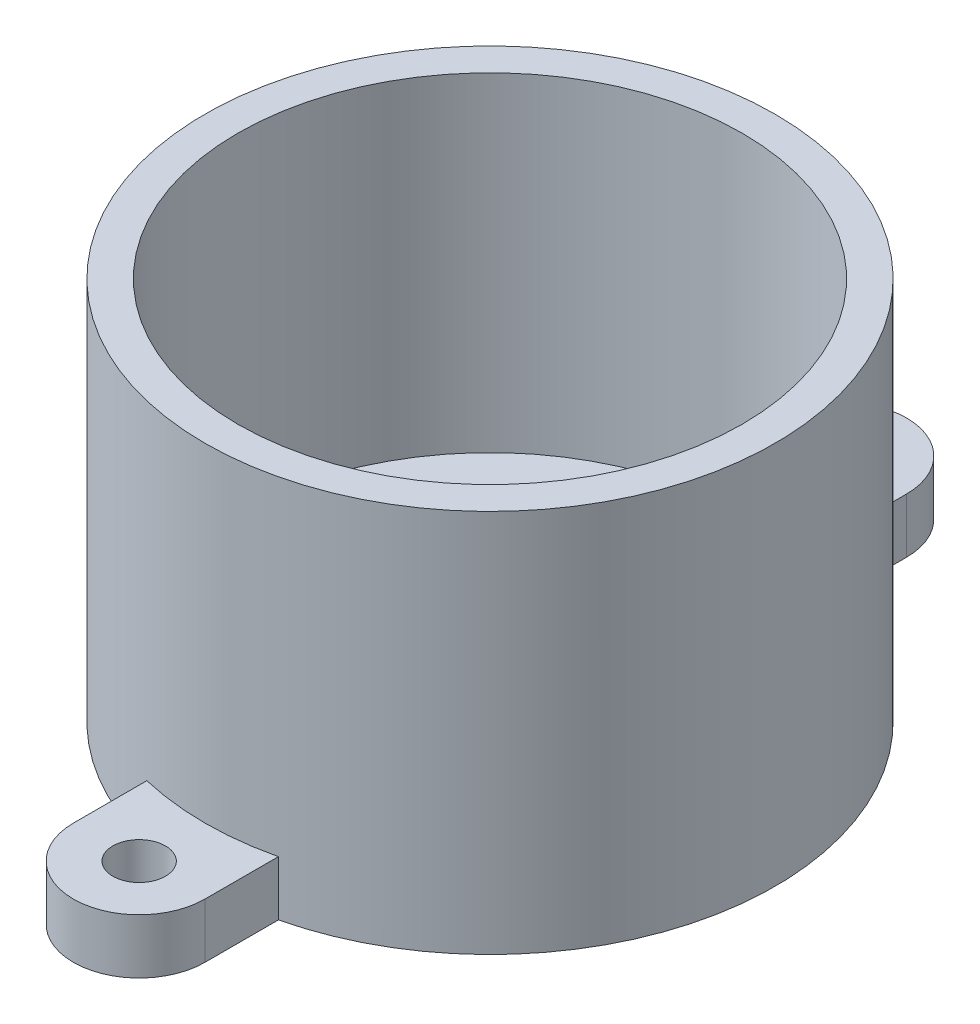
ISO-10303-21;
HEADER;
FILE_DESCRIPTION(('STEP AP214'),'2;1');
FILE_NAME('part.step','',(''),(''),'','','');
FILE_SCHEMA(('AUTOMOTIVE_DESIGN { 1 0 10303 214 1 1 1 1 }'));
ENDSEC;
DATA;
#1=APPLICATION_CONTEXT('core data for automotive mechanical design processes');
#2=APPLICATION_PROTOCOL_DEFINITION('international standard','automotive_design',2000,#1);
#3=PRODUCT_CONTEXT('',#1,'mechanical');
#4=PRODUCT('Part','Part','',(#3));
#5=PRODUCT_RELATED_PRODUCT_CATEGORY('part','',(#4));
#6=PRODUCT_DEFINITION_FORMATION('','',#4);
#7=PRODUCT_DEFINITION_CONTEXT('part definition',#1,'design');
#8=PRODUCT_DEFINITION('design','',#6,#7);
#9=PRODUCT_DEFINITION_SHAPE('','',#8);
#10=(LENGTH_UNIT() NAMED_UNIT(*) SI_UNIT(.MILLI.,.METRE.));
#11=(NAMED_UNIT(*) PLANE_ANGLE_UNIT() SI_UNIT($,.RADIAN.));
#12=(NAMED_UNIT(*) SI_UNIT($,.STERADIAN.) SOLID_ANGLE_UNIT());
#13=UNCERTAINTY_MEASURE_WITH_UNIT(LENGTH_MEASURE(1.E-05),#10,'distance_accuracy_value','');
#14=(GEOMETRIC_REPRESENTATION_CONTEXT(3) GLOBAL_UNCERTAINTY_ASSIGNED_CONTEXT((#13)) GLOBAL_UNIT_ASSIGNED_CONTEXT((#10,
#11,#12)) REPRESENTATION_CONTEXT('',''));
#15=CARTESIAN_POINT('',(0.,0.,0.));
#16=DIRECTION('',(0.,0.,1.));
#17=DIRECTION('',(1.,0.,0.));
#18=AXIS2_PLACEMENT_3D('',#15,#16,#17);
#19=CARTESIAN_POINT('',(0.,2.5,0.));
#20=DIRECTION('',(0.,-1.,0.));
#21=DIRECTION('',(0.,0.,-1.));
#22=AXIS2_PLACEMENT_3D('',#19,#20,#21);
#23=CYLINDRICAL_SURFACE('',#22,13.);
#24=CARTESIAN_POINT('',(0.,17.5,0.));
#25=DIRECTION('',(0.,1.,0.));
#26=DIRECTION('',(0.,0.,1.));
#27=AXIS2_PLACEMENT_3D('',#24,#25,#26);
#28=CIRCLE('',#27,13.);
#29=CARTESIAN_POINT('',(0.,17.5,13.));
#30=VERTEX_POINT('',#29);
#31=EDGE_CURVE('E238',#30,#30,#28,.T.);
#32=ORIENTED_EDGE('',*,*,#31,.F.);
#33=EDGE_LOOP('',(#32));
#34=FACE_BOUND('',#33,.T.);
#35=DIRECTION('',(0.,-1.,0.));
#36=VECTOR('',#35,1.);
#37=CARTESIAN_POINT('',(3.,2.5,-12.6491106406735));
#38=LINE('',#37,#36);
#39=CARTESIAN_POINT('',(3.,2.5,-12.6491106406735));
#40=VERTEX_POINT('',#39);
#41=CARTESIAN_POINT('',(3.,0.,-12.6491106406735));
#42=VERTEX_POINT('',#41);
#43=EDGE_CURVE('E62',#40,#42,#38,.T.);
#44=ORIENTED_EDGE('',*,*,#43,.F.);
#45=CARTESIAN_POINT('',(0.,2.5,0.));
#46=DIRECTION('',(0.,-1.,0.));
#47=DIRECTION('',(0.,0.,1.));
#48=AXIS2_PLACEMENT_3D('',#45,#46,#47);
#49=CIRCLE('',#48,13.);
#50=CARTESIAN_POINT('',(-3.,2.5,-12.6491106406735));
#51=VERTEX_POINT('',#50);
#52=EDGE_CURVE('E67',#51,#40,#49,.T.);
#53=ORIENTED_EDGE('',*,*,#52,.F.);
#54=DIRECTION('',(0.,-1.,0.));
#55=VECTOR('',#54,1.);
#56=CARTESIAN_POINT('',(-3.,2.5,-12.6491106406735));
#57=LINE('',#56,#55);
#58=CARTESIAN_POINT('',(-3.,0.,-12.6491106406735));
#59=VERTEX_POINT('',#58);
#60=EDGE_CURVE('E137',#51,#59,#57,.T.);
#61=ORIENTED_EDGE('',*,*,#60,.T.);
#62=CARTESIAN_POINT('',(0.,0.,0.));
#63=DIRECTION('',(0.,1.,0.));
#64=DIRECTION('',(0.,0.,1.));
#65=AXIS2_PLACEMENT_3D('',#62,#63,#64);
#66=CIRCLE('',#65,13.);
#67=CARTESIAN_POINT('',(-3.,0.,12.6491106406735));
#68=VERTEX_POINT('',#67);
#69=EDGE_CURVE('E242',#59,#68,#66,.T.);
#70=ORIENTED_EDGE('',*,*,#69,.T.);
#71=DIRECTION('',(0.,-1.,0.));
#72=VECTOR('',#71,1.);
#73=CARTESIAN_POINT('',(-3.,2.5,12.6491106406735));
#74=LINE('',#73,#72);
#75=CARTESIAN_POINT('',(-3.,2.5,12.6491106406735));
#76=VERTEX_POINT('',#75);
#77=EDGE_CURVE('E166',#76,#68,#74,.T.);
#78=ORIENTED_EDGE('',*,*,#77,.F.);
#79=CARTESIAN_POINT('',(0.,2.5,0.));
#80=DIRECTION('',(0.,-1.,0.));
#81=DIRECTION('',(0.,0.,-1.));
#82=AXIS2_PLACEMENT_3D('',#79,#80,#81);
#83=CIRCLE('',#82,13.);
#84=CARTESIAN_POINT('',(3.,2.5,12.6491106406735));
#85=VERTEX_POINT('',#84);
#86=EDGE_CURVE('E190',#85,#76,#83,.T.);
#87=ORIENTED_EDGE('',*,*,#86,.F.);
#88=DIRECTION('',(0.,-1.,0.));
#89=VECTOR('',#88,1.);
#90=CARTESIAN_POINT('',(3.,2.5,12.6491106406735));
#91=LINE('',#90,#89);
#92=CARTESIAN_POINT('',(3.,0.,12.6491106406735));
#93=VERTEX_POINT('',#92);
#94=EDGE_CURVE('E162',#85,#93,#91,.T.);
#95=ORIENTED_EDGE('',*,*,#94,.T.);
#96=EDGE_CURVE('E54',#93,#42,#66,.T.);
#97=ORIENTED_EDGE('',*,*,#96,.T.);
#98=EDGE_LOOP('',(#44,#53,#61,#70,#78,#87,#95,#97));
#99=FACE_BOUND('',#98,.T.);
#100=ADVANCED_FACE('F45',(#34,#99),#23,.T.);
#101=CARTESIAN_POINT('',(0.,0.,0.));
#102=DIRECTION('',(0.,1.,0.));
#103=DIRECTION('',(0.,0.,1.));
#104=AXIS2_PLACEMENT_3D('',#101,#102,#103);
#105=PLANE('',#104);
#106=CARTESIAN_POINT('',(0.,0.,-8.5));
#107=DIRECTION('',(0.,1.,0.));
#108=DIRECTION('',(0.,0.,1.));
#109=AXIS2_PLACEMENT_3D('',#106,#107,#108);
#110=CIRCLE('',#109,1.2);
#111=CARTESIAN_POINT('',(0.,0.,-7.3));
#112=VERTEX_POINT('',#111);
#113=EDGE_CURVE('E222',#112,#112,#110,.T.);
#114=ORIENTED_EDGE('',*,*,#113,.T.);
#115=EDGE_LOOP('',(#114));
#116=FACE_BOUND('',#115,.T.);
#117=CARTESIAN_POINT('',(0.,0.,0.));
#118=DIRECTION('',(0.,1.,0.));
#119=DIRECTION('',(0.,0.,1.));
#120=AXIS2_PLACEMENT_3D('',#117,#118,#119);
#121=CIRCLE('',#120,2.);
#122=CARTESIAN_POINT('',(0.,0.,2.));
#123=VERTEX_POINT('',#122);
#124=EDGE_CURVE('E208',#123,#123,#121,.T.);
#125=ORIENTED_EDGE('',*,*,#124,.T.);
#126=EDGE_LOOP('',(#125));
#127=FACE_BOUND('',#126,.T.);
#128=CARTESIAN_POINT('',(7.36121593216827,0.,4.24999999999969));
#129=DIRECTION('',(0.,1.,0.));
#130=DIRECTION('',(0.,0.,1.));
#131=AXIS2_PLACEMENT_3D('',#128,#129,#130);
#132=CIRCLE('',#131,1.20000000000047);
#133=CARTESIAN_POINT('',(7.36121593216827,0.,5.45000000000015));
#134=VERTEX_POINT('',#133);
#135=EDGE_CURVE('E218',#134,#134,#132,.T.);
#136=ORIENTED_EDGE('',*,*,#135,.T.);
#137=EDGE_LOOP('',(#136));
#138=FACE_BOUND('',#137,.T.);
#139=CARTESIAN_POINT('',(-7.36121593216719,0.,4.25000000000031));
#140=DIRECTION('',(0.,1.,0.));
#141=DIRECTION('',(0.,0.,1.));
#142=AXIS2_PLACEMENT_3D('',#139,#140,#141);
#143=CIRCLE('',#142,1.20000000000068);
#144=CARTESIAN_POINT('',(-7.36121593216719,0.,5.45000000000099));
#145=VERTEX_POINT('',#144);
#146=EDGE_CURVE('E213',#145,#145,#143,.T.);
#147=ORIENTED_EDGE('',*,*,#146,.T.);
#148=EDGE_LOOP('',(#147));
#149=FACE_BOUND('',#148,.T.);
#150=ORIENTED_EDGE('',*,*,#96,.F.);
#151=DIRECTION('',(0.,0.,-1.));
#152=VECTOR('',#151,1.);
#153=CARTESIAN_POINT('',(3.,0.,16.));
#154=LINE('',#153,#152);
#155=CARTESIAN_POINT('',(3.,0.,16.));
#156=VERTEX_POINT('',#155);
#157=EDGE_CURVE('E179',#156,#93,#154,.T.);
#158=ORIENTED_EDGE('',*,*,#157,.F.);
#159=CARTESIAN_POINT('',(0.,0.,16.));
#160=DIRECTION('',(0.,1.,0.));
#161=DIRECTION('',(0.,0.,1.));
#162=AXIS2_PLACEMENT_3D('',#159,#160,#161);
#163=CIRCLE('',#162,3.);
#164=CARTESIAN_POINT('',(-3.,0.,16.));
#165=VERTEX_POINT('',#164);
#166=EDGE_CURVE('E184',#165,#156,#163,.T.);
#167=ORIENTED_EDGE('',*,*,#166,.F.);
#168=DIRECTION('',(0.,0.,1.));
#169=VECTOR('',#168,1.);
#170=CARTESIAN_POINT('',(-3.,0.,12.6491106406735));
#171=LINE('',#170,#169);
#172=EDGE_CURVE('E175',#68,#165,#171,.T.);
#173=ORIENTED_EDGE('',*,*,#172,.F.);
#174=ORIENTED_EDGE('',*,*,#69,.F.);
#175=DIRECTION('',(0.,0.,1.));
#176=VECTOR('',#175,1.);
#177=CARTESIAN_POINT('',(-3.,0.,-12.6491106406735));
#178=LINE('',#177,#176);
#179=CARTESIAN_POINT('',(-3.,0.,-16.));
#180=VERTEX_POINT('',#179);
#181=EDGE_CURVE('E147',#180,#59,#178,.T.);
#182=ORIENTED_EDGE('',*,*,#181,.F.);
#183=CARTESIAN_POINT('',(0.,0.,-16.));
#184=DIRECTION('',(0.,1.,0.));
#185=DIRECTION('',(0.,0.,-1.));
#186=AXIS2_PLACEMENT_3D('',#183,#184,#185);
#187=CIRCLE('',#186,3.);
#188=CARTESIAN_POINT('',(3.,0.,-16.));
#189=VERTEX_POINT('',#188);
#190=EDGE_CURVE('E143',#189,#180,#187,.T.);
#191=ORIENTED_EDGE('',*,*,#190,.F.);
#192=DIRECTION('',(0.,0.,-1.));
#193=VECTOR('',#192,1.);
#194=CARTESIAN_POINT('',(3.,0.,-16.));
#195=LINE('',#194,#193);
#196=EDGE_CURVE('E125',#42,#189,#195,.T.);
#197=ORIENTED_EDGE('',*,*,#196,.F.);
#198=EDGE_LOOP('',(#150,#158,#167,#173,#174,#182,#191,#197));
#199=FACE_BOUND('',#198,.T.);
#200=CARTESIAN_POINT('',(0.,0.,16.));
#201=DIRECTION('',(0.,1.,0.));
#202=DIRECTION('',(0.,0.,-1.));
#203=AXIS2_PLACEMENT_3D('',#200,#201,#202);
#204=CIRCLE('',#203,1.2);
#205=CARTESIAN_POINT('',(0.,0.,14.8));
#206=VERTEX_POINT('',#205);
#207=EDGE_CURVE('E200',#206,#206,#204,.T.);
#208=ORIENTED_EDGE('',*,*,#207,.T.);
#209=EDGE_LOOP('',(#208));
#210=FACE_BOUND('',#209,.T.);
#211=CARTESIAN_POINT('',(0.,0.,-16.));
#212=DIRECTION('',(0.,1.,0.));
#213=DIRECTION('',(0.,0.,1.));
#214=AXIS2_PLACEMENT_3D('',#211,#212,#213);
#215=CIRCLE('',#214,1.2);
#216=CARTESIAN_POINT('',(0.,0.,-14.8));
#217=VERTEX_POINT('',#216);
#218=EDGE_CURVE('E204',#217,#217,#215,.T.);
#219=ORIENTED_EDGE('',*,*,#218,.T.);
#220=EDGE_LOOP('',(#219));
#221=FACE_BOUND('',#220,.T.);
#222=ADVANCED_FACE('F278',(#116,#127,#138,#149,#199,#210,#221),#105,.F.);
#223=CARTESIAN_POINT('',(0.,17.5,0.));
#224=DIRECTION('',(0.,1.,0.));
#225=DIRECTION('',(0.,0.,1.));
#226=AXIS2_PLACEMENT_3D('',#223,#224,#225);
#227=PLANE('',#226);
#228=ORIENTED_EDGE('',*,*,#31,.T.);
#229=EDGE_LOOP('',(#228));
#230=FACE_BOUND('',#229,.T.);
#231=CARTESIAN_POINT('',(0.,17.5,0.));
#232=DIRECTION('',(0.,1.,0.));
#233=DIRECTION('',(0.,0.,1.));
#234=AXIS2_PLACEMENT_3D('',#231,#232,#233);
#235=CIRCLE('',#234,11.5);
#236=CARTESIAN_POINT('',(0.,17.5,11.5));
#237=VERTEX_POINT('',#236);
#238=EDGE_CURVE('E231',#237,#237,#235,.T.);
#239=ORIENTED_EDGE('',*,*,#238,.F.);
#240=EDGE_LOOP('',(#239));
#241=FACE_BOUND('',#240,.T.);
#242=ADVANCED_FACE('F271',(#230,#241),#227,.T.);
#243=CARTESIAN_POINT('',(0.,17.5,0.));
#244=DIRECTION('',(0.,-1.,0.));
#245=DIRECTION('',(0.,0.,-1.));
#246=AXIS2_PLACEMENT_3D('',#243,#244,#245);
#247=CYLINDRICAL_SURFACE('',#246,11.5);
#248=ORIENTED_EDGE('',*,*,#238,.T.);
#249=EDGE_LOOP('',(#248));
#250=FACE_BOUND('',#249,.T.);
#251=CARTESIAN_POINT('',(0.,2.5,0.));
#252=DIRECTION('',(0.,1.,0.));
#253=DIRECTION('',(0.,0.,1.));
#254=AXIS2_PLACEMENT_3D('',#251,#252,#253);
#255=CIRCLE('',#254,11.5);
#256=CARTESIAN_POINT('',(0.,2.5,11.5));
#257=VERTEX_POINT('',#256);
#258=EDGE_CURVE('E11',#257,#257,#255,.F.);
#259=ORIENTED_EDGE('',*,*,#258,.T.);
#260=EDGE_LOOP('',(#259));
#261=FACE_BOUND('',#260,.T.);
#262=ADVANCED_FACE('F261',(#250,#261),#247,.F.);
#263=CARTESIAN_POINT('',(0.,2.5,0.));
#264=DIRECTION('',(0.,1.,0.));
#265=DIRECTION('',(0.,0.,1.));
#266=AXIS2_PLACEMENT_3D('',#263,#264,#265);
#267=PLANE('',#266);
#268=CARTESIAN_POINT('',(0.,2.5,-8.5));
#269=DIRECTION('',(0.,1.,0.));
#270=DIRECTION('',(0.,0.,1.));
#271=AXIS2_PLACEMENT_3D('',#268,#269,#270);
#272=CIRCLE('',#271,1.2);
#273=CARTESIAN_POINT('',(0.,2.5,-7.3));
#274=VERTEX_POINT('',#273);
#275=EDGE_CURVE('E48',#274,#274,#272,.T.);
#276=ORIENTED_EDGE('',*,*,#275,.F.);
#277=EDGE_LOOP('',(#276));
#278=FACE_BOUND('',#277,.T.);
#279=CARTESIAN_POINT('',(7.36121593216827,2.5,4.24999999999969));
#280=DIRECTION('',(0.,1.,0.));
#281=DIRECTION('',(0.,0.,1.));
#282=AXIS2_PLACEMENT_3D('',#279,#280,#281);
#283=CIRCLE('',#282,1.20000000000047);
#284=CARTESIAN_POINT('',(7.36121593216827,2.5,5.45000000000015));
#285=VERTEX_POINT('',#284);
#286=EDGE_CURVE('E217',#285,#285,#283,.T.);
#287=ORIENTED_EDGE('',*,*,#286,.F.);
#288=EDGE_LOOP('',(#287));
#289=FACE_BOUND('',#288,.T.);
#290=CARTESIAN_POINT('',(-7.36121593216719,2.5,4.25000000000031));
#291=DIRECTION('',(0.,1.,0.));
#292=DIRECTION('',(0.,0.,1.));
#293=AXIS2_PLACEMENT_3D('',#290,#291,#292);
#294=CIRCLE('',#293,1.20000000000068);
#295=CARTESIAN_POINT('',(-7.36121593216719,2.5,5.45000000000099));
#296=VERTEX_POINT('',#295);
#297=EDGE_CURVE('E212',#296,#296,#294,.T.);
#298=ORIENTED_EDGE('',*,*,#297,.F.);
#299=EDGE_LOOP('',(#298));
#300=FACE_BOUND('',#299,.T.);
#301=CARTESIAN_POINT('',(0.,2.5,0.));
#302=DIRECTION('',(0.,1.,0.));
#303=DIRECTION('',(0.,0.,1.));
#304=AXIS2_PLACEMENT_3D('',#301,#302,#303);
#305=CIRCLE('',#304,5.5);
#306=CARTESIAN_POINT('',(0.,2.5,5.5));
#307=VERTEX_POINT('',#306);
#308=EDGE_CURVE('E226',#307,#307,#305,.T.);
#309=ORIENTED_EDGE('',*,*,#308,.F.);
#310=EDGE_LOOP('',(#309));
#311=FACE_BOUND('',#310,.T.);
#312=ORIENTED_EDGE('',*,*,#258,.F.);
#313=EDGE_LOOP('',(#312));
#314=FACE_BOUND('',#313,.T.);
#315=ADVANCED_FACE('F257',(#278,#289,#300,#311,#314),#267,.T.);
#316=CARTESIAN_POINT('',(0.,1.3,0.));
#317=DIRECTION('',(0.,1.,0.));
#318=DIRECTION('',(0.,0.,1.));
#319=AXIS2_PLACEMENT_3D('',#316,#317,#318);
#320=CYLINDRICAL_SURFACE('',#319,5.5);
#321=CARTESIAN_POINT('',(0.,1.3,0.));
#322=DIRECTION('',(0.,1.,0.));
#323=DIRECTION('',(0.,0.,1.));
#324=AXIS2_PLACEMENT_3D('',#321,#322,#323);
#325=CIRCLE('',#324,5.5);
#326=CARTESIAN_POINT('',(0.,1.3,5.5));
#327=VERTEX_POINT('',#326);
#328=EDGE_CURVE('E227',#327,#327,#325,.T.);
#329=ORIENTED_EDGE('',*,*,#328,.F.);
#330=EDGE_LOOP('',(#329));
#331=FACE_BOUND('',#330,.T.);
#332=ORIENTED_EDGE('',*,*,#308,.T.);
#333=EDGE_LOOP('',(#332));
#334=FACE_BOUND('',#333,.T.);
#335=ADVANCED_FACE('F260',(#331,#334),#320,.F.);
#336=CARTESIAN_POINT('',(0.,1.3,0.));
#337=DIRECTION('',(0.,1.,0.));
#338=DIRECTION('',(0.,0.,1.));
#339=AXIS2_PLACEMENT_3D('',#336,#337,#338);
#340=PLANE('',#339);
#341=CARTESIAN_POINT('',(0.,1.3,0.));
#342=DIRECTION('',(0.,1.,0.));
#343=DIRECTION('',(0.,0.,1.));
#344=AXIS2_PLACEMENT_3D('',#341,#342,#343);
#345=CIRCLE('',#344,2.);
#346=CARTESIAN_POINT('',(0.,1.3,2.));
#347=VERTEX_POINT('',#346);
#348=EDGE_CURVE('E157',#347,#347,#345,.T.);
#349=ORIENTED_EDGE('',*,*,#348,.F.);
#350=EDGE_LOOP('',(#349));
#351=FACE_BOUND('',#350,.T.);
#352=ORIENTED_EDGE('',*,*,#328,.T.);
#353=EDGE_LOOP('',(#352));
#354=FACE_BOUND('',#353,.T.);
#355=ADVANCED_FACE('F359',(#351,#354),#340,.T.);
#356=CARTESIAN_POINT('',(0.,-1.2E-05,0.));
#357=DIRECTION('',(0.,1.,0.));
#358=DIRECTION('',(0.,0.,1.));
#359=AXIS2_PLACEMENT_3D('',#356,#357,#358);
#360=CYLINDRICAL_SURFACE('',#359,2.);
#361=CARTESIAN_POINT('',(0.,1.3,2.));
#362=CARTESIAN_POINT('',(0.,1.28645833333333,2.));
#363=CARTESIAN_POINT('',(0.,1.27291666666667,2.));
#364=CARTESIAN_POINT('',(0.,1.24583333333333,2.));
#365=CARTESIAN_POINT('',(0.,1.23229166666667,2.));
#366=CARTESIAN_POINT('',(0.,1.20520833333333,2.));
#367=CARTESIAN_POINT('',(0.,1.19166666666667,2.));
#368=CARTESIAN_POINT('',(0.,1.16458333333333,2.));
#369=CARTESIAN_POINT('',(0.,1.15104166666667,2.));
#370=CARTESIAN_POINT('',(0.,1.12395833333333,2.));
#371=CARTESIAN_POINT('',(0.,1.11041666666667,2.));
#372=CARTESIAN_POINT('',(0.,1.08333333333333,2.));
#373=CARTESIAN_POINT('',(0.,1.06979166666667,2.));
#374=CARTESIAN_POINT('',(0.,1.04270833333333,2.));
#375=CARTESIAN_POINT('',(0.,1.02916666666667,2.));
#376=CARTESIAN_POINT('',(0.,1.00208333333333,2.));
#377=CARTESIAN_POINT('',(0.,0.988541666666667,2.));
#378=CARTESIAN_POINT('',(0.,0.961458333333333,2.));
#379=CARTESIAN_POINT('',(0.,0.947916666666667,2.));
#380=CARTESIAN_POINT('',(0.,0.920833333333333,2.));
#381=CARTESIAN_POINT('',(0.,0.907291666666667,2.));
#382=CARTESIAN_POINT('',(0.,0.880208333333333,2.));
#383=CARTESIAN_POINT('',(0.,0.866666666666667,2.));
#384=CARTESIAN_POINT('',(0.,0.839583333333333,2.));
#385=CARTESIAN_POINT('',(0.,0.826041666666667,2.));
#386=CARTESIAN_POINT('',(0.,0.798958333333333,2.));
#387=CARTESIAN_POINT('',(0.,0.785416666666667,2.));
#388=CARTESIAN_POINT('',(0.,0.758333333333333,2.));
#389=CARTESIAN_POINT('',(0.,0.744791666666667,2.));
#390=CARTESIAN_POINT('',(0.,0.717708333333333,2.));
#391=CARTESIAN_POINT('',(0.,0.704166666666667,2.));
#392=CARTESIAN_POINT('',(0.,0.677083333333333,2.));
#393=CARTESIAN_POINT('',(0.,0.663541666666667,2.));
#394=CARTESIAN_POINT('',(0.,0.636458333333333,2.));
#395=CARTESIAN_POINT('',(0.,0.622916666666667,2.));
#396=CARTESIAN_POINT('',(0.,0.595833333333333,2.));
#397=CARTESIAN_POINT('',(0.,0.582291666666667,2.));
#398=CARTESIAN_POINT('',(0.,0.555208333333333,2.));
#399=CARTESIAN_POINT('',(0.,0.541666666666667,2.));
#400=CARTESIAN_POINT('',(0.,0.514583333333333,2.));
#401=CARTESIAN_POINT('',(0.,0.501041666666667,2.));
#402=CARTESIAN_POINT('',(0.,0.473958333333333,2.));
#403=CARTESIAN_POINT('',(0.,0.460416666666667,2.));
#404=CARTESIAN_POINT('',(0.,0.433333333333333,2.));
#405=CARTESIAN_POINT('',(0.,0.419791666666667,2.));
#406=CARTESIAN_POINT('',(0.,0.392708333333333,2.));
#407=CARTESIAN_POINT('',(0.,0.379166666666667,2.));
#408=CARTESIAN_POINT('',(0.,0.352083333333333,2.));
#409=CARTESIAN_POINT('',(0.,0.338541666666667,2.));
#410=CARTESIAN_POINT('',(0.,0.311458333333333,2.));
#411=CARTESIAN_POINT('',(0.,0.297916666666667,2.));
#412=CARTESIAN_POINT('',(0.,0.270833333333333,2.));
#413=CARTESIAN_POINT('',(0.,0.257291666666667,2.));
#414=CARTESIAN_POINT('',(0.,0.230208333333333,2.));
#415=CARTESIAN_POINT('',(0.,0.216666666666667,2.));
#416=CARTESIAN_POINT('',(0.,0.189583333333333,2.));
#417=CARTESIAN_POINT('',(0.,0.176041666666667,2.));
#418=CARTESIAN_POINT('',(0.,0.148958333333333,2.));
#419=CARTESIAN_POINT('',(0.,0.135416666666667,2.));
#420=CARTESIAN_POINT('',(0.,0.108333333333333,2.));
#421=CARTESIAN_POINT('',(0.,0.0947916666666666,2.));
#422=CARTESIAN_POINT('',(0.,0.0677083333333333,2.));
#423=CARTESIAN_POINT('',(0.,0.0541666666666667,2.));
#424=CARTESIAN_POINT('',(0.,0.0270833333333334,2.));
#425=CARTESIAN_POINT('',(0.,0.0135416666666667,2.));
#426=CARTESIAN_POINT('',(0.,0.,2.));
#427=B_SPLINE_CURVE_WITH_KNOTS('',3,(#361,#362,#363,#364,#365,#366,#367,#368,#369,#370,#371,
#372,#373,#374,#375,#376,#377,#378,#379,#380,#381,#382,#383,#384,#385,#386,#387,#388,#389,#390,
#391,#392,#393,#394,#395,#396,#397,#398,#399,#400,#401,#402,#403,#404,#405,#406,#407,#408,#409,
#410,#411,#412,#413,#414,#415,#416,#417,#418,#419,#420,#421,#422,#423,#424,#425,#426),
.UNSPECIFIED.,.F.,.F.,(4,2,2,2,2,2,2,2,2,2,2,2,2,2,2,2,2,2,2,2,2,2,2,2,2,2,2,2,2,2,2,2,4),(0.,
0.0406250000000001,0.0812499999999999,0.121875,0.1625,0.203125,0.24375,0.284375,0.325,0.365625,
0.40625,0.446875,0.4875,0.528125,0.56875,0.609375,0.65,0.690625,0.73125,0.771875,0.8125,
0.853125,0.89375,0.934375,0.975,1.015625,1.05625,1.096875,1.1375,1.178125,1.21875,1.259375,1.3),.UNSPECIFIED.);
#428=EDGE_CURVE('BSEAM355',#347,#123,#427,.T.);
#429=ORIENTED_EDGE('',*,*,#348,.T.);
#430=ORIENTED_EDGE('',*,*,#124,.F.);
#431=ORIENTED_EDGE('',*,*,#428,.T.);
#432=ORIENTED_EDGE('',*,*,#428,.F.);
#433=EDGE_LOOP('',(#429,#431,#430,#432));
#434=FACE_BOUND('',#433,.T.);
#435=ADVANCED_FACE('F355',(#434),#360,.F.);
#436=CARTESIAN_POINT('',(-7.36121593216719,-1.2E-05,4.25000000000031));
#437=DIRECTION('',(0.,1.,0.));
#438=DIRECTION('',(0.,0.,1.));
#439=AXIS2_PLACEMENT_3D('',#436,#437,#438);
#440=CYLINDRICAL_SURFACE('',#439,1.20000000000068);
#441=CARTESIAN_POINT('',(-7.36121593216719,2.5,5.45000000000099));
#442=CARTESIAN_POINT('',(-7.36121593216719,2.47395833333333,5.45000000000099));
#443=CARTESIAN_POINT('',(-7.36121593216719,2.44791666666667,5.45000000000099));
#444=CARTESIAN_POINT('',(-7.36121593216719,2.39583333333333,5.45000000000099));
#445=CARTESIAN_POINT('',(-7.36121593216719,2.36979166666667,5.45000000000099));
#446=CARTESIAN_POINT('',(-7.36121593216719,2.31770833333333,5.45000000000099));
#447=CARTESIAN_POINT('',(-7.36121593216719,2.29166666666667,5.45000000000099));
#448=CARTESIAN_POINT('',(-7.36121593216719,2.23958333333333,5.45000000000099));
#449=CARTESIAN_POINT('',(-7.36121593216719,2.21354166666667,5.45000000000099));
#450=CARTESIAN_POINT('',(-7.36121593216719,2.16145833333333,5.45000000000099));
#451=CARTESIAN_POINT('',(-7.36121593216719,2.13541666666667,5.45000000000099));
#452=CARTESIAN_POINT('',(-7.36121593216719,2.08333333333333,5.45000000000099));
#453=CARTESIAN_POINT('',(-7.36121593216719,2.05729166666667,5.45000000000099));
#454=CARTESIAN_POINT('',(-7.36121593216719,2.00520833333333,5.45000000000099));
#455=CARTESIAN_POINT('',(-7.36121593216719,1.97916666666667,5.45000000000099));
#456=CARTESIAN_POINT('',(-7.36121593216719,1.92708333333333,5.45000000000099));
#457=CARTESIAN_POINT('',(-7.36121593216719,1.90104166666667,5.45000000000099));
#458=CARTESIAN_POINT('',(-7.36121593216719,1.84895833333333,5.45000000000099));
#459=CARTESIAN_POINT('',(-7.36121593216719,1.82291666666667,5.45000000000099));
#460=CARTESIAN_POINT('',(-7.36121593216719,1.77083333333333,5.45000000000099));
#461=CARTESIAN_POINT('',(-7.36121593216719,1.74479166666667,5.45000000000099));
#462=CARTESIAN_POINT('',(-7.36121593216719,1.69270833333333,5.45000000000099));
#463=CARTESIAN_POINT('',(-7.36121593216719,1.66666666666667,5.45000000000099));
#464=CARTESIAN_POINT('',(-7.36121593216719,1.61458333333333,5.45000000000099));
#465=CARTESIAN_POINT('',(-7.36121593216719,1.58854166666667,5.45000000000099));
#466=CARTESIAN_POINT('',(-7.36121593216719,1.53645833333333,5.45000000000099));
#467=CARTESIAN_POINT('',(-7.36121593216719,1.51041666666667,5.45000000000099));
#468=CARTESIAN_POINT('',(-7.36121593216719,1.45833333333333,5.45000000000099));
#469=CARTESIAN_POINT('',(-7.36121593216719,1.43229166666667,5.45000000000099));
#470=CARTESIAN_POINT('',(-7.36121593216719,1.38020833333333,5.45000000000099));
#471=CARTESIAN_POINT('',(-7.36121593216719,1.35416666666667,5.45000000000099));
#472=CARTESIAN_POINT('',(-7.36121593216719,1.30208333333333,5.45000000000099));
#473=CARTESIAN_POINT('',(-7.36121593216719,1.27604166666667,5.45000000000099));
#474=CARTESIAN_POINT('',(-7.36121593216719,1.22395833333333,5.45000000000099));
#475=CARTESIAN_POINT('',(-7.36121593216719,1.19791666666667,5.45000000000099));
#476=CARTESIAN_POINT('',(-7.36121593216719,1.14583333333333,5.45000000000099));
#477=CARTESIAN_POINT('',(-7.36121593216719,1.11979166666667,5.45000000000099));
#478=CARTESIAN_POINT('',(-7.36121593216719,1.06770833333333,5.45000000000099));
#479=CARTESIAN_POINT('',(-7.36121593216719,1.04166666666667,5.45000000000099));
#480=CARTESIAN_POINT('',(-7.36121593216719,0.989583333333333,5.45000000000099));
#481=CARTESIAN_POINT('',(-7.36121593216719,0.963541666666667,5.45000000000099));
#482=CARTESIAN_POINT('',(-7.36121593216719,0.911458333333333,5.45000000000099));
#483=CARTESIAN_POINT('',(-7.36121593216719,0.885416666666667,5.45000000000099));
#484=CARTESIAN_POINT('',(-7.36121593216719,0.833333333333333,5.45000000000099));
#485=CARTESIAN_POINT('',(-7.36121593216719,0.807291666666667,5.45000000000099));
#486=CARTESIAN_POINT('',(-7.36121593216719,0.755208333333333,5.45000000000099));
#487=CARTESIAN_POINT('',(-7.36121593216719,0.729166666666667,5.45000000000099));
#488=CARTESIAN_POINT('',(-7.36121593216719,0.677083333333333,5.45000000000099));
#489=CARTESIAN_POINT('',(-7.36121593216719,0.651041666666667,5.45000000000099));
#490=CARTESIAN_POINT('',(-7.36121593216719,0.598958333333333,5.45000000000099));
#491=CARTESIAN_POINT('',(-7.36121593216719,0.572916666666667,5.45000000000099));
#492=CARTESIAN_POINT('',(-7.36121593216719,0.520833333333333,5.45000000000099));
#493=CARTESIAN_POINT('',(-7.36121593216719,0.494791666666667,5.45000000000099));
#494=CARTESIAN_POINT('',(-7.36121593216719,0.442708333333333,5.45000000000099));
#495=CARTESIAN_POINT('',(-7.36121593216719,0.416666666666667,5.45000000000099));
#496=CARTESIAN_POINT('',(-7.36121593216719,0.364583333333333,5.45000000000099));
#497=CARTESIAN_POINT('',(-7.36121593216719,0.338541666666667,5.45000000000099));
#498=CARTESIAN_POINT('',(-7.36121593216719,0.286458333333333,5.45000000000099));
#499=CARTESIAN_POINT('',(-7.36121593216719,0.260416666666667,5.45000000000099));
#500=CARTESIAN_POINT('',(-7.36121593216719,0.208333333333334,5.45000000000099));
#501=CARTESIAN_POINT('',(-7.36121593216719,0.182291666666667,5.45000000000099));
#502=CARTESIAN_POINT('',(-7.36121593216719,0.130208333333334,5.45000000000099));
#503=CARTESIAN_POINT('',(-7.36121593216719,0.104166666666667,5.45000000000099));
#504=CARTESIAN_POINT('',(-7.36121593216719,0.0520833333333336,5.45000000000099));
#505=CARTESIAN_POINT('',(-7.36121593216719,0.0260416666666669,5.45000000000099));
#506=CARTESIAN_POINT('',(-7.36121593216719,0.,5.45000000000099));
#507=B_SPLINE_CURVE_WITH_KNOTS('',3,(#441,#442,#443,#444,#445,#446,#447,#448,#449,#450,#451,
#452,#453,#454,#455,#456,#457,#458,#459,#460,#461,#462,#463,#464,#465,#466,#467,#468,#469,#470,
#471,#472,#473,#474,#475,#476,#477,#478,#479,#480,#481,#482,#483,#484,#485,#486,#487,#488,#489,
#490,#491,#492,#493,#494,#495,#496,#497,#498,#499,#500,#501,#502,#503,#504,#505,#506),
.UNSPECIFIED.,.F.,.F.,(4,2,2,2,2,2,2,2,2,2,2,2,2,2,2,2,2,2,2,2,2,2,2,2,2,2,2,2,2,2,2,2,4),(0.,
0.0781250000000001,0.15625,0.234375,0.3125,0.390625,0.46875,0.546875,0.625,0.703125,0.78125,
0.859374999999999,0.9375,1.015625,1.09375,1.171875,1.25,1.328125,1.40625,1.484375,1.5625,
1.640625,1.71875,1.796875,1.875,1.953125,2.03125,2.109375,2.1875,2.265625,2.34375,2.421875,2.5),.UNSPECIFIED.);
#508=EDGE_CURVE('BSEAM358',#296,#145,#507,.T.);
#509=ORIENTED_EDGE('',*,*,#297,.T.);
#510=ORIENTED_EDGE('',*,*,#146,.F.);
#511=ORIENTED_EDGE('',*,*,#508,.T.);
#512=ORIENTED_EDGE('',*,*,#508,.F.);
#513=EDGE_LOOP('',(#509,#511,#510,#512));
#514=FACE_BOUND('',#513,.T.);
#515=ADVANCED_FACE('F358',(#514),#440,.F.);
#516=CARTESIAN_POINT('',(7.36121593216827,-1.2E-05,4.24999999999969));
#517=DIRECTION('',(0.,1.,0.));
#518=DIRECTION('',(0.,0.,1.));
#519=AXIS2_PLACEMENT_3D('',#516,#517,#518);
#520=CYLINDRICAL_SURFACE('',#519,1.20000000000047);
#521=CARTESIAN_POINT('',(7.36121593216827,2.5,5.45000000000015));
#522=CARTESIAN_POINT('',(7.36121593216827,2.47395833333333,5.45000000000015));
#523=CARTESIAN_POINT('',(7.36121593216827,2.44791666666667,5.45000000000015));
#524=CARTESIAN_POINT('',(7.36121593216827,2.39583333333333,5.45000000000015));
#525=CARTESIAN_POINT('',(7.36121593216827,2.36979166666667,5.45000000000015));
#526=CARTESIAN_POINT('',(7.36121593216827,2.31770833333333,5.45000000000015));
#527=CARTESIAN_POINT('',(7.36121593216827,2.29166666666667,5.45000000000015));
#528=CARTESIAN_POINT('',(7.36121593216827,2.23958333333333,5.45000000000015));
#529=CARTESIAN_POINT('',(7.36121593216827,2.21354166666667,5.45000000000015));
#530=CARTESIAN_POINT('',(7.36121593216827,2.16145833333333,5.45000000000015));
#531=CARTESIAN_POINT('',(7.36121593216827,2.13541666666667,5.45000000000015));
#532=CARTESIAN_POINT('',(7.36121593216827,2.08333333333333,5.45000000000015));
#533=CARTESIAN_POINT('',(7.36121593216827,2.05729166666667,5.45000000000015));
#534=CARTESIAN_POINT('',(7.36121593216827,2.00520833333333,5.45000000000015));
#535=CARTESIAN_POINT('',(7.36121593216827,1.97916666666667,5.45000000000015));
#536=CARTESIAN_POINT('',(7.36121593216827,1.92708333333333,5.45000000000015));
#537=CARTESIAN_POINT('',(7.36121593216827,1.90104166666667,5.45000000000015));
#538=CARTESIAN_POINT('',(7.36121593216827,1.84895833333333,5.45000000000015));
#539=CARTESIAN_POINT('',(7.36121593216827,1.82291666666667,5.45000000000015));
#540=CARTESIAN_POINT('',(7.36121593216827,1.77083333333333,5.45000000000015));
#541=CARTESIAN_POINT('',(7.36121593216827,1.74479166666667,5.45000000000015));
#542=CARTESIAN_POINT('',(7.36121593216827,1.69270833333333,5.45000000000015));
#543=CARTESIAN_POINT('',(7.36121593216827,1.66666666666667,5.45000000000015));
#544=CARTESIAN_POINT('',(7.36121593216827,1.61458333333333,5.45000000000015));
#545=CARTESIAN_POINT('',(7.36121593216827,1.58854166666667,5.45000000000015));
#546=CARTESIAN_POINT('',(7.36121593216827,1.53645833333333,5.45000000000015));
#547=CARTESIAN_POINT('',(7.36121593216827,1.51041666666667,5.45000000000015));
#548=CARTESIAN_POINT('',(7.36121593216827,1.45833333333333,5.45000000000015));
#549=CARTESIAN_POINT('',(7.36121593216827,1.43229166666667,5.45000000000015));
#550=CARTESIAN_POINT('',(7.36121593216827,1.38020833333333,5.45000000000015));
#551=CARTESIAN_POINT('',(7.36121593216827,1.35416666666667,5.45000000000015));
#552=CARTESIAN_POINT('',(7.36121593216827,1.30208333333333,5.45000000000015));
#553=CARTESIAN_POINT('',(7.36121593216827,1.27604166666667,5.45000000000015));
#554=CARTESIAN_POINT('',(7.36121593216827,1.22395833333333,5.45000000000015));
#555=CARTESIAN_POINT('',(7.36121593216827,1.19791666666667,5.45000000000015));
#556=CARTESIAN_POINT('',(7.36121593216827,1.14583333333333,5.45000000000015));
#557=CARTESIAN_POINT('',(7.36121593216827,1.11979166666667,5.45000000000015));
#558=CARTESIAN_POINT('',(7.36121593216827,1.06770833333333,5.45000000000015));
#559=CARTESIAN_POINT('',(7.36121593216827,1.04166666666667,5.45000000000015));
#560=CARTESIAN_POINT('',(7.36121593216827,0.989583333333333,5.45000000000015));
#561=CARTESIAN_POINT('',(7.36121593216827,0.963541666666667,5.45000000000015));
#562=CARTESIAN_POINT('',(7.36121593216827,0.911458333333333,5.45000000000015));
#563=CARTESIAN_POINT('',(7.36121593216827,0.885416666666667,5.45000000000015));
#564=CARTESIAN_POINT('',(7.36121593216827,0.833333333333333,5.45000000000015));
#565=CARTESIAN_POINT('',(7.36121593216827,0.807291666666667,5.45000000000015));
#566=CARTESIAN_POINT('',(7.36121593216827,0.755208333333333,5.45000000000015));
#567=CARTESIAN_POINT('',(7.36121593216827,0.729166666666667,5.45000000000015));
#568=CARTESIAN_POINT('',(7.36121593216827,0.677083333333333,5.45000000000015));
#569=CARTESIAN_POINT('',(7.36121593216827,0.651041666666667,5.45000000000015));
#570=CARTESIAN_POINT('',(7.36121593216827,0.598958333333333,5.45000000000015));
#571=CARTESIAN_POINT('',(7.36121593216827,0.572916666666667,5.45000000000015));
#572=CARTESIAN_POINT('',(7.36121593216827,0.520833333333333,5.45000000000015));
#573=CARTESIAN_POINT('',(7.36121593216827,0.494791666666667,5.45000000000015));
#574=CARTESIAN_POINT('',(7.36121593216827,0.442708333333333,5.45000000000015));
#575=CARTESIAN_POINT('',(7.36121593216827,0.416666666666667,5.45000000000015));
#576=CARTESIAN_POINT('',(7.36121593216827,0.364583333333333,5.45000000000015));
#577=CARTESIAN_POINT('',(7.36121593216827,0.338541666666667,5.45000000000015));
#578=CARTESIAN_POINT('',(7.36121593216827,0.286458333333333,5.45000000000015));
#579=CARTESIAN_POINT('',(7.36121593216827,0.260416666666667,5.45000000000015));
#580=CARTESIAN_POINT('',(7.36121593216827,0.208333333333334,5.45000000000015));
#581=CARTESIAN_POINT('',(7.36121593216827,0.182291666666667,5.45000000000015));
#582=CARTESIAN_POINT('',(7.36121593216827,0.130208333333334,5.45000000000015));
#583=CARTESIAN_POINT('',(7.36121593216827,0.104166666666667,5.45000000000015));
#584=CARTESIAN_POINT('',(7.36121593216827,0.0520833333333336,5.45000000000015));
#585=CARTESIAN_POINT('',(7.36121593216827,0.0260416666666669,5.45000000000015));
#586=CARTESIAN_POINT('',(7.36121593216827,0.,5.45000000000015));
#587=B_SPLINE_CURVE_WITH_KNOTS('',3,(#521,#522,#523,#524,#525,#526,#527,#528,#529,#530,#531,
#532,#533,#534,#535,#536,#537,#538,#539,#540,#541,#542,#543,#544,#545,#546,#547,#548,#549,#550,
#551,#552,#553,#554,#555,#556,#557,#558,#559,#560,#561,#562,#563,#564,#565,#566,#567,#568,#569,
#570,#571,#572,#573,#574,#575,#576,#577,#578,#579,#580,#581,#582,#583,#584,#585,#586),
.UNSPECIFIED.,.F.,.F.,(4,2,2,2,2,2,2,2,2,2,2,2,2,2,2,2,2,2,2,2,2,2,2,2,2,2,2,2,2,2,2,2,4),(0.,
0.0781250000000001,0.15625,0.234375,0.3125,0.390625,0.46875,0.546875,0.625,0.703125,0.78125,
0.859374999999999,0.9375,1.015625,1.09375,1.171875,1.25,1.328125,1.40625,1.484375,1.5625,
1.640625,1.71875,1.796875,1.875,1.953125,2.03125,2.109375,2.1875,2.265625,2.34375,2.421875,2.5),.UNSPECIFIED.);
#588=EDGE_CURVE('BSEAM254',#285,#134,#587,.T.);
#589=ORIENTED_EDGE('',*,*,#286,.T.);
#590=ORIENTED_EDGE('',*,*,#135,.F.);
#591=ORIENTED_EDGE('',*,*,#588,.T.);
#592=ORIENTED_EDGE('',*,*,#588,.F.);
#593=EDGE_LOOP('',(#589,#591,#590,#592));
#594=FACE_BOUND('',#593,.T.);
#595=ADVANCED_FACE('F254',(#594),#520,.F.);
#596=CARTESIAN_POINT('',(0.,-1.2E-05,-8.5));
#597=DIRECTION('',(0.,1.,0.));
#598=DIRECTION('',(0.,0.,1.));
#599=AXIS2_PLACEMENT_3D('',#596,#597,#598);
#600=CYLINDRICAL_SURFACE('',#599,1.2);
#601=CARTESIAN_POINT('',(0.,2.5,-7.3));
#602=CARTESIAN_POINT('',(0.,2.47395833333333,-7.3));
#603=CARTESIAN_POINT('',(0.,2.44791666666667,-7.3));
#604=CARTESIAN_POINT('',(0.,2.39583333333333,-7.3));
#605=CARTESIAN_POINT('',(0.,2.36979166666667,-7.3));
#606=CARTESIAN_POINT('',(0.,2.31770833333333,-7.3));
#607=CARTESIAN_POINT('',(0.,2.29166666666667,-7.3));
#608=CARTESIAN_POINT('',(0.,2.23958333333333,-7.3));
#609=CARTESIAN_POINT('',(0.,2.21354166666667,-7.3));
#610=CARTESIAN_POINT('',(0.,2.16145833333333,-7.3));
#611=CARTESIAN_POINT('',(0.,2.13541666666667,-7.3));
#612=CARTESIAN_POINT('',(0.,2.08333333333333,-7.3));
#613=CARTESIAN_POINT('',(0.,2.05729166666667,-7.3));
#614=CARTESIAN_POINT('',(0.,2.00520833333333,-7.3));
#615=CARTESIAN_POINT('',(0.,1.97916666666667,-7.3));
#616=CARTESIAN_POINT('',(0.,1.92708333333333,-7.3));
#617=CARTESIAN_POINT('',(0.,1.90104166666667,-7.3));
#618=CARTESIAN_POINT('',(0.,1.84895833333333,-7.3));
#619=CARTESIAN_POINT('',(0.,1.82291666666667,-7.3));
#620=CARTESIAN_POINT('',(0.,1.77083333333333,-7.3));
#621=CARTESIAN_POINT('',(0.,1.74479166666667,-7.3));
#622=CARTESIAN_POINT('',(0.,1.69270833333333,-7.3));
#623=CARTESIAN_POINT('',(0.,1.66666666666667,-7.3));
#624=CARTESIAN_POINT('',(0.,1.61458333333333,-7.3));
#625=CARTESIAN_POINT('',(0.,1.58854166666667,-7.3));
#626=CARTESIAN_POINT('',(0.,1.53645833333333,-7.3));
#627=CARTESIAN_POINT('',(0.,1.51041666666667,-7.3));
#628=CARTESIAN_POINT('',(0.,1.45833333333333,-7.3));
#629=CARTESIAN_POINT('',(0.,1.43229166666667,-7.3));
#630=CARTESIAN_POINT('',(0.,1.38020833333333,-7.3));
#631=CARTESIAN_POINT('',(0.,1.35416666666667,-7.3));
#632=CARTESIAN_POINT('',(0.,1.30208333333333,-7.3));
#633=CARTESIAN_POINT('',(0.,1.27604166666667,-7.3));
#634=CARTESIAN_POINT('',(0.,1.22395833333333,-7.3));
#635=CARTESIAN_POINT('',(0.,1.19791666666667,-7.3));
#636=CARTESIAN_POINT('',(0.,1.14583333333333,-7.3));
#637=CARTESIAN_POINT('',(0.,1.11979166666667,-7.3));
#638=CARTESIAN_POINT('',(0.,1.06770833333333,-7.3));
#639=CARTESIAN_POINT('',(0.,1.04166666666667,-7.3));
#640=CARTESIAN_POINT('',(0.,0.989583333333333,-7.3));
#641=CARTESIAN_POINT('',(0.,0.963541666666667,-7.3));
#642=CARTESIAN_POINT('',(0.,0.911458333333333,-7.3));
#643=CARTESIAN_POINT('',(0.,0.885416666666667,-7.3));
#644=CARTESIAN_POINT('',(0.,0.833333333333333,-7.3));
#645=CARTESIAN_POINT('',(0.,0.807291666666667,-7.3));
#646=CARTESIAN_POINT('',(0.,0.755208333333333,-7.3));
#647=CARTESIAN_POINT('',(0.,0.729166666666667,-7.3));
#648=CARTESIAN_POINT('',(0.,0.677083333333333,-7.3));
#649=CARTESIAN_POINT('',(0.,0.651041666666667,-7.3));
#650=CARTESIAN_POINT('',(0.,0.598958333333333,-7.3));
#651=CARTESIAN_POINT('',(0.,0.572916666666667,-7.3));
#652=CARTESIAN_POINT('',(0.,0.520833333333333,-7.3));
#653=CARTESIAN_POINT('',(0.,0.494791666666667,-7.3));
#654=CARTESIAN_POINT('',(0.,0.442708333333333,-7.3));
#655=CARTESIAN_POINT('',(0.,0.416666666666667,-7.3));
#656=CARTESIAN_POINT('',(0.,0.364583333333333,-7.3));
#657=CARTESIAN_POINT('',(0.,0.338541666666667,-7.3));
#658=CARTESIAN_POINT('',(0.,0.286458333333333,-7.3));
#659=CARTESIAN_POINT('',(0.,0.260416666666667,-7.3));
#660=CARTESIAN_POINT('',(0.,0.208333333333334,-7.3));
#661=CARTESIAN_POINT('',(0.,0.182291666666667,-7.3));
#662=CARTESIAN_POINT('',(0.,0.130208333333334,-7.3));
#663=CARTESIAN_POINT('',(0.,0.104166666666667,-7.3));
#664=CARTESIAN_POINT('',(0.,0.0520833333333336,-7.3));
#665=CARTESIAN_POINT('',(0.,0.0260416666666669,-7.3));
#666=CARTESIAN_POINT('',(0.,0.,-7.3));
#667=B_SPLINE_CURVE_WITH_KNOTS('',3,(#601,#602,#603,#604,#605,#606,#607,#608,#609,#610,#611,
#612,#613,#614,#615,#616,#617,#618,#619,#620,#621,#622,#623,#624,#625,#626,#627,#628,#629,#630,
#631,#632,#633,#634,#635,#636,#637,#638,#639,#640,#641,#642,#643,#644,#645,#646,#647,#648,#649,
#650,#651,#652,#653,#654,#655,#656,#657,#658,#659,#660,#661,#662,#663,#664,#665,#666),
.UNSPECIFIED.,.F.,.F.,(4,2,2,2,2,2,2,2,2,2,2,2,2,2,2,2,2,2,2,2,2,2,2,2,2,2,2,2,2,2,2,2,4),(0.,
0.0781250000000001,0.15625,0.234375,0.3125,0.390625,0.46875,0.546875,0.625,0.703125,0.78125,
0.859374999999999,0.9375,1.015625,1.09375,1.171875,1.25,1.328125,1.40625,1.484375,1.5625,
1.640625,1.71875,1.796875,1.875,1.953125,2.03125,2.109375,2.1875,2.265625,2.34375,2.421875,2.5),.UNSPECIFIED.);
#668=EDGE_CURVE('BSEAM350',#274,#112,#667,.T.);
#669=ORIENTED_EDGE('',*,*,#275,.T.);
#670=ORIENTED_EDGE('',*,*,#113,.F.);
#671=ORIENTED_EDGE('',*,*,#668,.T.);
#672=ORIENTED_EDGE('',*,*,#668,.F.);
#673=EDGE_LOOP('',(#669,#671,#670,#672));
#674=FACE_BOUND('',#673,.T.);
#675=ADVANCED_FACE('F350',(#674),#600,.F.);
#676=CARTESIAN_POINT('',(0.,2.5,16.));
#677=DIRECTION('',(0.,1.,0.));
#678=DIRECTION('',(0.,0.,1.));
#679=AXIS2_PLACEMENT_3D('',#676,#677,#678);
#680=PLANE('',#679);
#681=CARTESIAN_POINT('',(0.,2.5,16.));
#682=DIRECTION('',(0.,1.,0.));
#683=DIRECTION('',(0.,0.,1.));
#684=AXIS2_PLACEMENT_3D('',#681,#682,#683);
#685=CIRCLE('',#684,3.);
#686=CARTESIAN_POINT('',(-3.,2.5,16.));
#687=VERTEX_POINT('',#686);
#688=CARTESIAN_POINT('',(3.,2.5,16.));
#689=VERTEX_POINT('',#688);
#690=EDGE_CURVE('E180',#687,#689,#685,.T.);
#691=ORIENTED_EDGE('',*,*,#690,.T.);
#692=DIRECTION('',(0.,0.,-1.));
#693=VECTOR('',#692,1.);
#694=CARTESIAN_POINT('',(3.,2.5,16.));
#695=LINE('',#694,#693);
#696=EDGE_CURVE('E194',#689,#85,#695,.T.);
#697=ORIENTED_EDGE('',*,*,#696,.T.);
#698=ORIENTED_EDGE('',*,*,#86,.T.);
#699=DIRECTION('',(0.,0.,1.));
#700=VECTOR('',#699,1.);
#701=CARTESIAN_POINT('',(-3.,2.5,12.6491106406735));
#702=LINE('',#701,#700);
#703=EDGE_CURVE('E174',#76,#687,#702,.T.);
#704=ORIENTED_EDGE('',*,*,#703,.T.);
#705=EDGE_LOOP('',(#691,#697,#698,#704));
#706=FACE_BOUND('',#705,.T.);
#707=CARTESIAN_POINT('',(0.,2.5,16.));
#708=DIRECTION('',(0.,1.,0.));
#709=DIRECTION('',(0.,0.,-1.));
#710=AXIS2_PLACEMENT_3D('',#707,#708,#709);
#711=CIRCLE('',#710,1.2);
#712=CARTESIAN_POINT('',(0.,2.5,14.8));
#713=VERTEX_POINT('',#712);
#714=EDGE_CURVE('E187',#713,#713,#711,.T.);
#715=ORIENTED_EDGE('',*,*,#714,.F.);
#716=EDGE_LOOP('',(#715));
#717=FACE_BOUND('',#716,.T.);
#718=ADVANCED_FACE('F342',(#706,#717),#680,.T.);
#719=CARTESIAN_POINT('',(0.,2.5,16.));
#720=DIRECTION('',(0.,-1.,0.));
#721=DIRECTION('',(0.,0.,-1.));
#722=AXIS2_PLACEMENT_3D('',#719,#720,#721);
#723=CYLINDRICAL_SURFACE('',#722,3.);
#724=ORIENTED_EDGE('',*,*,#166,.T.);
#725=DIRECTION('',(0.,-1.,0.));
#726=VECTOR('',#725,1.);
#727=CARTESIAN_POINT('',(3.,2.5,16.));
#728=LINE('',#727,#726);
#729=EDGE_CURVE('E158',#689,#156,#728,.T.);
#730=ORIENTED_EDGE('',*,*,#729,.F.);
#731=ORIENTED_EDGE('',*,*,#690,.F.);
#732=DIRECTION('',(0.,-1.,0.));
#733=VECTOR('',#732,1.);
#734=CARTESIAN_POINT('',(-3.,2.5,16.));
#735=LINE('',#734,#733);
#736=EDGE_CURVE('E170',#687,#165,#735,.T.);
#737=ORIENTED_EDGE('',*,*,#736,.T.);
#738=EDGE_LOOP('',(#724,#730,#731,#737));
#739=FACE_BOUND('',#738,.T.);
#740=ADVANCED_FACE('F338',(#739),#723,.T.);
#741=CARTESIAN_POINT('',(3.,2.5,16.));
#742=DIRECTION('',(-1.,0.,0.));
#743=DIRECTION('',(0.,0.,1.));
#744=AXIS2_PLACEMENT_3D('',#741,#742,#743);
#745=PLANE('',#744);
#746=ORIENTED_EDGE('',*,*,#157,.T.);
#747=ORIENTED_EDGE('',*,*,#94,.F.);
#748=ORIENTED_EDGE('',*,*,#696,.F.);
#749=ORIENTED_EDGE('',*,*,#729,.T.);
#750=EDGE_LOOP('',(#746,#747,#748,#749));
#751=FACE_BOUND('',#750,.T.);
#752=ADVANCED_FACE('F341',(#751),#745,.F.);
#753=CARTESIAN_POINT('',(-3.,2.5,12.6491106406735));
#754=DIRECTION('',(1.,0.,0.));
#755=DIRECTION('',(0.,0.,-1.));
#756=AXIS2_PLACEMENT_3D('',#753,#754,#755);
#757=PLANE('',#756);
#758=ORIENTED_EDGE('',*,*,#172,.T.);
#759=ORIENTED_EDGE('',*,*,#736,.F.);
#760=ORIENTED_EDGE('',*,*,#703,.F.);
#761=ORIENTED_EDGE('',*,*,#77,.T.);
#762=EDGE_LOOP('',(#758,#759,#760,#761));
#763=FACE_BOUND('',#762,.T.);
#764=ADVANCED_FACE('F327',(#763),#757,.F.);
#765=CARTESIAN_POINT('',(0.,2.5,16.));
#766=DIRECTION('',(0.,-1.,0.));
#767=DIRECTION('',(0.,0.,-1.));
#768=AXIS2_PLACEMENT_3D('',#765,#766,#767);
#769=CYLINDRICAL_SURFACE('',#768,1.2);
#770=ORIENTED_EDGE('',*,*,#714,.T.);
#771=EDGE_LOOP('',(#770));
#772=FACE_BOUND('',#771,.T.);
#773=ORIENTED_EDGE('',*,*,#207,.F.);
#774=EDGE_LOOP('',(#773));
#775=FACE_BOUND('',#774,.T.);
#776=ADVANCED_FACE('F320',(#772,#775),#769,.F.);
#777=CARTESIAN_POINT('',(0.,2.5,0.));
#778=DIRECTION('',(0.,1.,0.));
#779=DIRECTION('',(0.,0.,1.));
#780=AXIS2_PLACEMENT_3D('',#777,#778,#779);
#781=PLANE('',#780);
#782=ORIENTED_EDGE('',*,*,#52,.T.);
#783=DIRECTION('',(0.,0.,-1.));
#784=VECTOR('',#783,1.);
#785=CARTESIAN_POINT('',(3.,2.5,-16.));
#786=LINE('',#785,#784);
#787=CARTESIAN_POINT('',(3.,2.5,-16.));
#788=VERTEX_POINT('',#787);
#789=EDGE_CURVE('E110',#40,#788,#786,.T.);
#790=ORIENTED_EDGE('',*,*,#789,.T.);
#791=CARTESIAN_POINT('',(0.,2.5,-16.));
#792=DIRECTION('',(0.,1.,0.));
#793=DIRECTION('',(0.,0.,-1.));
#794=AXIS2_PLACEMENT_3D('',#791,#792,#793);
#795=CIRCLE('',#794,3.);
#796=CARTESIAN_POINT('',(-3.,2.5,-16.));
#797=VERTEX_POINT('',#796);
#798=EDGE_CURVE('E115',#788,#797,#795,.T.);
#799=ORIENTED_EDGE('',*,*,#798,.T.);
#800=DIRECTION('',(0.,0.,1.));
#801=VECTOR('',#800,1.);
#802=CARTESIAN_POINT('',(-3.,2.5,-12.6491106406735));
#803=LINE('',#802,#801);
#804=EDGE_CURVE('E134',#797,#51,#803,.T.);
#805=ORIENTED_EDGE('',*,*,#804,.T.);
#806=EDGE_LOOP('',(#782,#790,#799,#805));
#807=FACE_BOUND('',#806,.T.);
#808=CARTESIAN_POINT('',(0.,2.5,-16.));
#809=DIRECTION('',(0.,1.,0.));
#810=DIRECTION('',(0.,0.,1.));
#811=AXIS2_PLACEMENT_3D('',#808,#809,#810);
#812=CIRCLE('',#811,1.2);
#813=CARTESIAN_POINT('',(0.,2.5,-14.8));
#814=VERTEX_POINT('',#813);
#815=EDGE_CURVE('E144',#814,#814,#812,.T.);
#816=ORIENTED_EDGE('',*,*,#815,.F.);
#817=EDGE_LOOP('',(#816));
#818=FACE_BOUND('',#817,.T.);
#819=ADVANCED_FACE('F112',(#807,#818),#781,.T.);
#820=CARTESIAN_POINT('',(3.,2.5,-16.));
#821=DIRECTION('',(-1.,0.,0.));
#822=DIRECTION('',(0.,0.,1.));
#823=AXIS2_PLACEMENT_3D('',#820,#821,#822);
#824=PLANE('',#823);
#825=ORIENTED_EDGE('',*,*,#196,.T.);
#826=DIRECTION('',(0.,-1.,0.));
#827=VECTOR('',#826,1.);
#828=CARTESIAN_POINT('',(3.,2.5,-16.));
#829=LINE('',#828,#827);
#830=EDGE_CURVE('E122',#788,#189,#829,.T.);
#831=ORIENTED_EDGE('',*,*,#830,.F.);
#832=ORIENTED_EDGE('',*,*,#789,.F.);
#833=ORIENTED_EDGE('',*,*,#43,.T.);
#834=EDGE_LOOP('',(#825,#831,#832,#833));
#835=FACE_BOUND('',#834,.T.);
#836=ADVANCED_FACE('F123',(#835),#824,.F.);
#837=CARTESIAN_POINT('',(0.,2.5,-16.));
#838=DIRECTION('',(0.,-1.,0.));
#839=DIRECTION('',(0.,0.,-1.));
#840=AXIS2_PLACEMENT_3D('',#837,#838,#839);
#841=CYLINDRICAL_SURFACE('',#840,3.);
#842=ORIENTED_EDGE('',*,*,#190,.T.);
#843=DIRECTION('',(0.,-1.,0.));
#844=VECTOR('',#843,1.);
#845=CARTESIAN_POINT('',(-3.,2.5,-16.));
#846=LINE('',#845,#844);
#847=EDGE_CURVE('E128',#797,#180,#846,.T.);
#848=ORIENTED_EDGE('',*,*,#847,.F.);
#849=ORIENTED_EDGE('',*,*,#798,.F.);
#850=ORIENTED_EDGE('',*,*,#830,.T.);
#851=EDGE_LOOP('',(#842,#848,#849,#850));
#852=FACE_BOUND('',#851,.T.);
#853=ADVANCED_FACE('F130',(#852),#841,.T.);
#854=CARTESIAN_POINT('',(-3.,2.5,-12.6491106406735));
#855=DIRECTION('',(1.,0.,0.));
#856=DIRECTION('',(0.,0.,-1.));
#857=AXIS2_PLACEMENT_3D('',#854,#855,#856);
#858=PLANE('',#857);
#859=ORIENTED_EDGE('',*,*,#181,.T.);
#860=ORIENTED_EDGE('',*,*,#60,.F.);
#861=ORIENTED_EDGE('',*,*,#804,.F.);
#862=ORIENTED_EDGE('',*,*,#847,.T.);
#863=EDGE_LOOP('',(#859,#860,#861,#862));
#864=FACE_BOUND('',#863,.T.);
#865=ADVANCED_FACE('F332',(#864),#858,.F.);
#866=CARTESIAN_POINT('',(0.,2.5,-16.));
#867=DIRECTION('',(0.,-1.,0.));
#868=DIRECTION('',(0.,0.,-1.));
#869=AXIS2_PLACEMENT_3D('',#866,#867,#868);
#870=CYLINDRICAL_SURFACE('',#869,1.2);
#871=ORIENTED_EDGE('',*,*,#815,.T.);
#872=EDGE_LOOP('',(#871));
#873=FACE_BOUND('',#872,.T.);
#874=ORIENTED_EDGE('',*,*,#218,.F.);
#875=EDGE_LOOP('',(#874));
#876=FACE_BOUND('',#875,.T.);
#877=ADVANCED_FACE('F318',(#873,#876),#870,.F.);
#878=CLOSED_SHELL('',(#100,#222,#242,#262,#315,#335,#355,#435,#515,#595,#675,#718,#740,#752,
#764,#776,#819,#836,#853,#865,#877));
#879=MANIFOLD_SOLID_BREP('B2',#878);
#880=ADVANCED_BREP_SHAPE_REPRESENTATION('',(#18,#879),#14);
#881=SHAPE_DEFINITION_REPRESENTATION(#9,#880);
ENDSEC;
END-ISO-10303-21;
